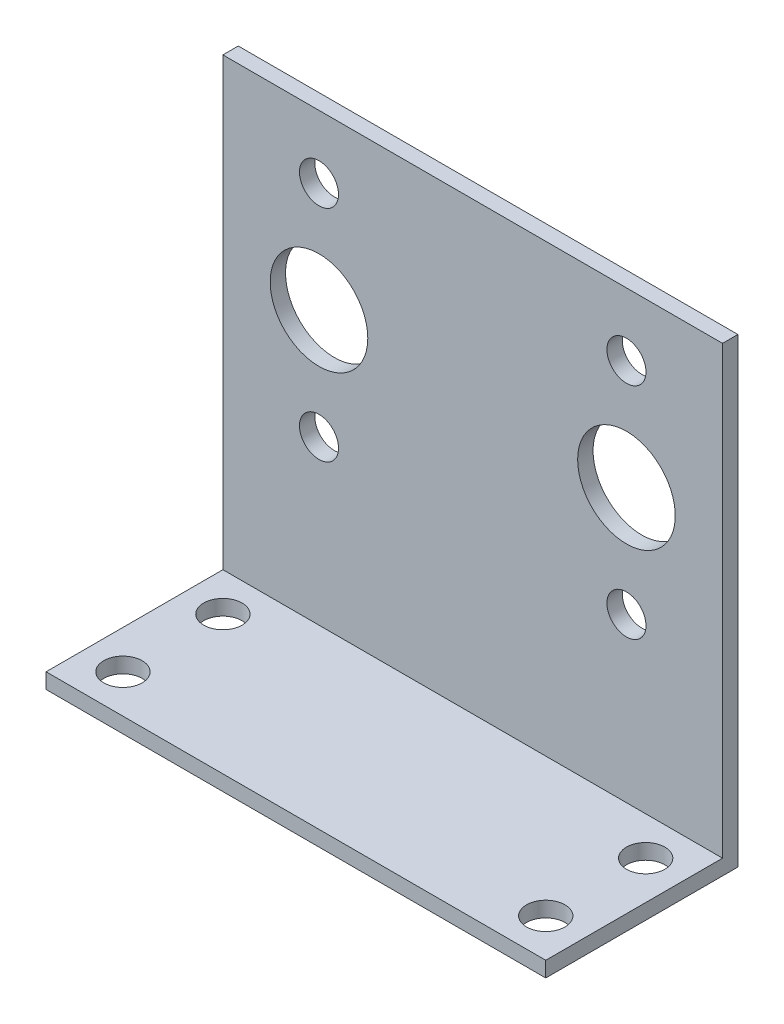
ISO-10303-21;
HEADER;
FILE_DESCRIPTION(('STEP AP214'),'2;1');
FILE_NAME('part.step','',(''),(''),'','','');
FILE_SCHEMA(('AUTOMOTIVE_DESIGN { 1 0 10303 214 1 1 1 1 }'));
ENDSEC;
DATA;
#1=APPLICATION_CONTEXT('core data for automotive mechanical design processes');
#2=APPLICATION_PROTOCOL_DEFINITION('international standard','automotive_design',2000,#1);
#3=PRODUCT_CONTEXT('',#1,'mechanical');
#4=PRODUCT('Part','Part','',(#3));
#5=PRODUCT_RELATED_PRODUCT_CATEGORY('part','',(#4));
#6=PRODUCT_DEFINITION_FORMATION('','',#4);
#7=PRODUCT_DEFINITION_CONTEXT('part definition',#1,'design');
#8=PRODUCT_DEFINITION('design','',#6,#7);
#9=PRODUCT_DEFINITION_SHAPE('','',#8);
#10=(LENGTH_UNIT() NAMED_UNIT(*) SI_UNIT(.MILLI.,.METRE.));
#11=(NAMED_UNIT(*) PLANE_ANGLE_UNIT() SI_UNIT($,.RADIAN.));
#12=(NAMED_UNIT(*) SI_UNIT($,.STERADIAN.) SOLID_ANGLE_UNIT());
#13=UNCERTAINTY_MEASURE_WITH_UNIT(LENGTH_MEASURE(1.E-05),#10,'distance_accuracy_value','');
#14=(GEOMETRIC_REPRESENTATION_CONTEXT(3) GLOBAL_UNCERTAINTY_ASSIGNED_CONTEXT((#13)) GLOBAL_UNIT_ASSIGNED_CONTEXT((#10,
#11,#12)) REPRESENTATION_CONTEXT('',''));
#15=CARTESIAN_POINT('',(0.,0.,0.));
#16=DIRECTION('',(0.,0.,1.));
#17=DIRECTION('',(1.,0.,0.));
#18=AXIS2_PLACEMENT_3D('',#15,#16,#17);
#19=CARTESIAN_POINT('',(0.,0.,4.));
#20=DIRECTION('',(0.,0.,-1.));
#21=DIRECTION('',(-1.,0.,0.));
#22=AXIS2_PLACEMENT_3D('',#19,#20,#21);
#23=PLANE('',#22);
#24=CARTESIAN_POINT('',(-40.,15.,4.));
#25=DIRECTION('',(0.,0.,1.));
#26=DIRECTION('',(1.,0.,0.));
#27=AXIS2_PLACEMENT_3D('',#24,#25,#26);
#28=CIRCLE('',#27,12.7);
#29=CARTESIAN_POINT('',(-27.3,15.,4.));
#30=VERTEX_POINT('',#29);
#31=EDGE_CURVE('E135',#30,#30,#28,.T.);
#32=ORIENTED_EDGE('',*,*,#31,.F.);
#33=EDGE_LOOP('',(#32));
#34=FACE_BOUND('',#33,.T.);
#35=CARTESIAN_POINT('',(40.,43.575,4.));
#36=DIRECTION('',(0.,0.,1.));
#37=DIRECTION('',(-1.,0.,0.));
#38=AXIS2_PLACEMENT_3D('',#35,#36,#37);
#39=CIRCLE('',#38,5.08000000000001);
#40=CARTESIAN_POINT('',(34.92,43.575,4.));
#41=VERTEX_POINT('',#40);
#42=EDGE_CURVE('E125',#41,#41,#39,.T.);
#43=ORIENTED_EDGE('',*,*,#42,.F.);
#44=EDGE_LOOP('',(#43));
#45=FACE_BOUND('',#44,.T.);
#46=CARTESIAN_POINT('',(40.,15.,4.));
#47=DIRECTION('',(0.,0.,1.));
#48=DIRECTION('',(-1.,0.,0.));
#49=AXIS2_PLACEMENT_3D('',#46,#47,#48);
#50=CIRCLE('',#49,12.7);
#51=CARTESIAN_POINT('',(27.3,15.,4.));
#52=VERTEX_POINT('',#51);
#53=EDGE_CURVE('E129',#52,#52,#50,.T.);
#54=ORIENTED_EDGE('',*,*,#53,.F.);
#55=EDGE_LOOP('',(#54));
#56=FACE_BOUND('',#55,.T.);
#57=CARTESIAN_POINT('',(40.,-13.575,4.));
#58=DIRECTION('',(0.,0.,1.));
#59=DIRECTION('',(1.,0.,0.));
#60=AXIS2_PLACEMENT_3D('',#57,#58,#59);
#61=CIRCLE('',#60,5.08000000000001);
#62=CARTESIAN_POINT('',(45.08,-13.575,4.));
#63=VERTEX_POINT('',#62);
#64=EDGE_CURVE('E148',#63,#63,#61,.T.);
#65=ORIENTED_EDGE('',*,*,#64,.F.);
#66=EDGE_LOOP('',(#65));
#67=FACE_BOUND('',#66,.T.);
#68=CARTESIAN_POINT('',(-40.,-13.575,4.));
#69=DIRECTION('',(0.,0.,1.));
#70=DIRECTION('',(-1.,0.,0.));
#71=AXIS2_PLACEMENT_3D('',#68,#69,#70);
#72=CIRCLE('',#71,5.08000000000001);
#73=CARTESIAN_POINT('',(-45.08,-13.575,4.));
#74=VERTEX_POINT('',#73);
#75=EDGE_CURVE('E142',#74,#74,#72,.T.);
#76=ORIENTED_EDGE('',*,*,#75,.F.);
#77=EDGE_LOOP('',(#76));
#78=FACE_BOUND('',#77,.T.);
#79=CARTESIAN_POINT('',(-40.,43.575,4.));
#80=DIRECTION('',(0.,0.,1.));
#81=DIRECTION('',(1.,0.,0.));
#82=AXIS2_PLACEMENT_3D('',#79,#80,#81);
#83=CIRCLE('',#82,5.08000000000001);
#84=CARTESIAN_POINT('',(-34.92,43.575,4.));
#85=VERTEX_POINT('',#84);
#86=EDGE_CURVE('E136',#85,#85,#83,.T.);
#87=ORIENTED_EDGE('',*,*,#86,.F.);
#88=EDGE_LOOP('',(#87));
#89=FACE_BOUND('',#88,.T.);
#90=DIRECTION('',(-1.,0.,0.));
#91=VECTOR('',#90,1.);
#92=CARTESIAN_POINT('',(0.,-56.,4.));
#93=LINE('',#92,#91);
#94=CARTESIAN_POINT('',(65.,-56.,4.));
#95=VERTEX_POINT('',#94);
#96=CARTESIAN_POINT('',(-65.,-56.,4.));
#97=VERTEX_POINT('',#96);
#98=EDGE_CURVE('E51',#95,#97,#93,.T.);
#99=ORIENTED_EDGE('',*,*,#98,.F.);
#100=DIRECTION('',(0.,1.,0.));
#101=VECTOR('',#100,1.);
#102=CARTESIAN_POINT('',(65.,60.,4.));
#103=LINE('',#102,#101);
#104=CARTESIAN_POINT('',(65.,60.,4.));
#105=VERTEX_POINT('',#104);
#106=EDGE_CURVE('E163',#95,#105,#103,.T.);
#107=ORIENTED_EDGE('',*,*,#106,.T.);
#108=DIRECTION('',(-1.,0.,0.));
#109=VECTOR('',#108,1.);
#110=CARTESIAN_POINT('',(65.,60.,4.));
#111=LINE('',#110,#109);
#112=CARTESIAN_POINT('',(-65.,60.,4.));
#113=VERTEX_POINT('',#112);
#114=EDGE_CURVE('E166',#105,#113,#111,.T.);
#115=ORIENTED_EDGE('',*,*,#114,.T.);
#116=DIRECTION('',(0.,-1.,0.));
#117=VECTOR('',#116,1.);
#118=CARTESIAN_POINT('',(-65.,60.,4.));
#119=LINE('',#118,#117);
#120=EDGE_CURVE('E56',#113,#97,#119,.T.);
#121=ORIENTED_EDGE('',*,*,#120,.T.);
#122=EDGE_LOOP('',(#99,#107,#115,#121));
#123=FACE_BOUND('',#122,.T.);
#124=ADVANCED_FACE('F36',(#34,#45,#56,#67,#78,#89,#123),#23,.F.);
#125=CARTESIAN_POINT('',(-65.,60.,4.));
#126=DIRECTION('',(1.,0.,0.));
#127=DIRECTION('',(0.,0.,-1.));
#128=AXIS2_PLACEMENT_3D('',#125,#126,#127);
#129=PLANE('',#128);
#130=DIRECTION('',(0.,0.,-1.));
#131=VECTOR('',#130,1.);
#132=CARTESIAN_POINT('',(-65.,-60.,4.));
#133=LINE('',#132,#131);
#134=CARTESIAN_POINT('',(-65.,-60.,50.));
#135=VERTEX_POINT('',#134);
#136=CARTESIAN_POINT('',(-65.,-60.,0.));
#137=VERTEX_POINT('',#136);
#138=EDGE_CURVE('E11',#135,#137,#133,.T.);
#139=ORIENTED_EDGE('',*,*,#138,.F.);
#140=DIRECTION('',(0.,-1.,0.));
#141=VECTOR('',#140,1.);
#142=CARTESIAN_POINT('',(-65.,0.,50.));
#143=LINE('',#142,#141);
#144=CARTESIAN_POINT('',(-65.,-56.,50.));
#145=VERTEX_POINT('',#144);
#146=EDGE_CURVE('E102',#145,#135,#143,.T.);
#147=ORIENTED_EDGE('',*,*,#146,.F.);
#148=DIRECTION('',(0.,0.,-1.));
#149=VECTOR('',#148,1.);
#150=CARTESIAN_POINT('',(-65.,-56.,50.));
#151=LINE('',#150,#149);
#152=EDGE_CURVE('E120',#145,#97,#151,.T.);
#153=ORIENTED_EDGE('',*,*,#152,.T.);
#154=ORIENTED_EDGE('',*,*,#120,.F.);
#155=DIRECTION('',(0.,0.,-1.));
#156=VECTOR('',#155,1.);
#157=CARTESIAN_POINT('',(-65.,60.,4.));
#158=LINE('',#157,#156);
#159=CARTESIAN_POINT('',(-65.,60.,0.));
#160=VERTEX_POINT('',#159);
#161=EDGE_CURVE('E168',#113,#160,#158,.T.);
#162=ORIENTED_EDGE('',*,*,#161,.T.);
#163=DIRECTION('',(0.,-1.,0.));
#164=VECTOR('',#163,1.);
#165=CARTESIAN_POINT('',(-65.,60.,0.));
#166=LINE('',#165,#164);
#167=EDGE_CURVE('E159',#160,#137,#166,.T.);
#168=ORIENTED_EDGE('',*,*,#167,.T.);
#169=EDGE_LOOP('',(#139,#147,#153,#154,#162,#168));
#170=FACE_BOUND('',#169,.T.);
#171=ADVANCED_FACE('F38',(#170),#129,.F.);
#172=CARTESIAN_POINT('',(65.,-60.,4.));
#173=DIRECTION('',(0.,1.,0.));
#174=DIRECTION('',(-1.,0.,0.));
#175=AXIS2_PLACEMENT_3D('',#172,#173,#174);
#176=PLANE('',#175);
#177=CARTESIAN_POINT('',(55.,-60.,14.));
#178=DIRECTION('',(0.,-1.,0.));
#179=DIRECTION('',(0.,0.,1.));
#180=AXIS2_PLACEMENT_3D('',#177,#178,#179);
#181=CIRCLE('',#180,5.);
#182=CARTESIAN_POINT('',(55.,-60.,19.));
#183=VERTEX_POINT('',#182);
#184=EDGE_CURVE('E231',#183,#183,#181,.T.);
#185=ORIENTED_EDGE('',*,*,#184,.F.);
#186=EDGE_LOOP('',(#185));
#187=FACE_BOUND('',#186,.T.);
#188=CARTESIAN_POINT('',(55.,-60.,40.));
#189=DIRECTION('',(0.,-1.,0.));
#190=DIRECTION('',(0.,0.,1.));
#191=AXIS2_PLACEMENT_3D('',#188,#189,#190);
#192=CIRCLE('',#191,5.);
#193=CARTESIAN_POINT('',(55.,-60.,45.));
#194=VERTEX_POINT('',#193);
#195=EDGE_CURVE('E235',#194,#194,#192,.T.);
#196=ORIENTED_EDGE('',*,*,#195,.F.);
#197=EDGE_LOOP('',(#196));
#198=FACE_BOUND('',#197,.T.);
#199=CARTESIAN_POINT('',(-55.,-60.,14.));
#200=DIRECTION('',(0.,1.,0.));
#201=DIRECTION('',(0.,0.,1.));
#202=AXIS2_PLACEMENT_3D('',#199,#200,#201);
#203=CIRCLE('',#202,5.);
#204=CARTESIAN_POINT('',(-55.,-60.,19.));
#205=VERTEX_POINT('',#204);
#206=EDGE_CURVE('E108',#205,#205,#203,.T.);
#207=ORIENTED_EDGE('',*,*,#206,.T.);
#208=EDGE_LOOP('',(#207));
#209=FACE_BOUND('',#208,.T.);
#210=CARTESIAN_POINT('',(-55.,-60.,40.));
#211=DIRECTION('',(0.,1.,0.));
#212=DIRECTION('',(0.,0.,1.));
#213=AXIS2_PLACEMENT_3D('',#210,#211,#212);
#214=CIRCLE('',#213,5.);
#215=CARTESIAN_POINT('',(-55.,-60.,45.));
#216=VERTEX_POINT('',#215);
#217=EDGE_CURVE('E240',#216,#216,#214,.T.);
#218=ORIENTED_EDGE('',*,*,#217,.T.);
#219=EDGE_LOOP('',(#218));
#220=FACE_BOUND('',#219,.T.);
#221=DIRECTION('',(1.,0.,0.));
#222=VECTOR('',#221,1.);
#223=CARTESIAN_POINT('',(65.,-60.,0.));
#224=LINE('',#223,#222);
#225=CARTESIAN_POINT('',(65.,-60.,0.));
#226=VERTEX_POINT('',#225);
#227=EDGE_CURVE('E91',#137,#226,#224,.T.);
#228=ORIENTED_EDGE('',*,*,#227,.T.);
#229=DIRECTION('',(0.,0.,-1.));
#230=VECTOR('',#229,1.);
#231=CARTESIAN_POINT('',(65.,-60.,4.));
#232=LINE('',#231,#230);
#233=CARTESIAN_POINT('',(65.,-60.,50.));
#234=VERTEX_POINT('',#233);
#235=EDGE_CURVE('E44',#234,#226,#232,.T.);
#236=ORIENTED_EDGE('',*,*,#235,.F.);
#237=DIRECTION('',(-1.,0.,0.));
#238=VECTOR('',#237,1.);
#239=CARTESIAN_POINT('',(0.,-60.,50.));
#240=LINE('',#239,#238);
#241=EDGE_CURVE('E89',#234,#135,#240,.T.);
#242=ORIENTED_EDGE('',*,*,#241,.T.);
#243=ORIENTED_EDGE('',*,*,#138,.T.);
#244=EDGE_LOOP('',(#228,#236,#242,#243));
#245=FACE_BOUND('',#244,.T.);
#246=ADVANCED_FACE('F88',(#187,#198,#209,#220,#245),#176,.F.);
#247=CARTESIAN_POINT('',(65.,60.,4.));
#248=DIRECTION('',(-1.,0.,0.));
#249=DIRECTION('',(0.,-1.,0.));
#250=AXIS2_PLACEMENT_3D('',#247,#248,#249);
#251=PLANE('',#250);
#252=DIRECTION('',(0.,1.,0.));
#253=VECTOR('',#252,1.);
#254=CARTESIAN_POINT('',(65.,60.,0.));
#255=LINE('',#254,#253);
#256=CARTESIAN_POINT('',(65.,60.,0.));
#257=VERTEX_POINT('',#256);
#258=EDGE_CURVE('E171',#226,#257,#255,.T.);
#259=ORIENTED_EDGE('',*,*,#258,.T.);
#260=DIRECTION('',(0.,0.,-1.));
#261=VECTOR('',#260,1.);
#262=CARTESIAN_POINT('',(65.,60.,4.));
#263=LINE('',#262,#261);
#264=EDGE_CURVE('E95',#105,#257,#263,.T.);
#265=ORIENTED_EDGE('',*,*,#264,.F.);
#266=ORIENTED_EDGE('',*,*,#106,.F.);
#267=DIRECTION('',(0.,0.,-1.));
#268=VECTOR('',#267,1.);
#269=CARTESIAN_POINT('',(65.,-56.,50.));
#270=LINE('',#269,#268);
#271=CARTESIAN_POINT('',(65.,-56.,50.));
#272=VERTEX_POINT('',#271);
#273=EDGE_CURVE('E106',#272,#95,#270,.T.);
#274=ORIENTED_EDGE('',*,*,#273,.F.);
#275=DIRECTION('',(0.,-1.,0.));
#276=VECTOR('',#275,1.);
#277=CARTESIAN_POINT('',(64.9999999999998,2.25514051876984E-13,50.));
#278=LINE('',#277,#276);
#279=EDGE_CURVE('E100',#272,#234,#278,.T.);
#280=ORIENTED_EDGE('',*,*,#279,.T.);
#281=ORIENTED_EDGE('',*,*,#235,.T.);
#282=EDGE_LOOP('',(#259,#265,#266,#274,#280,#281));
#283=FACE_BOUND('',#282,.T.);
#284=ADVANCED_FACE('F104',(#283),#251,.F.);
#285=CARTESIAN_POINT('',(65.,60.,4.));
#286=DIRECTION('',(0.,-1.,0.));
#287=DIRECTION('',(1.,0.,0.));
#288=AXIS2_PLACEMENT_3D('',#285,#286,#287);
#289=PLANE('',#288);
#290=DIRECTION('',(-1.,0.,0.));
#291=VECTOR('',#290,1.);
#292=CARTESIAN_POINT('',(65.,60.,0.));
#293=LINE('',#292,#291);
#294=EDGE_CURVE('E164',#257,#160,#293,.T.);
#295=ORIENTED_EDGE('',*,*,#294,.T.);
#296=ORIENTED_EDGE('',*,*,#161,.F.);
#297=ORIENTED_EDGE('',*,*,#114,.F.);
#298=ORIENTED_EDGE('',*,*,#264,.T.);
#299=EDGE_LOOP('',(#295,#296,#297,#298));
#300=FACE_BOUND('',#299,.T.);
#301=ADVANCED_FACE('F181',(#300),#289,.F.);
#302=CARTESIAN_POINT('',(0.,0.,0.));
#303=DIRECTION('',(0.,0.,-1.));
#304=DIRECTION('',(-1.,0.,0.));
#305=AXIS2_PLACEMENT_3D('',#302,#303,#304);
#306=PLANE('',#305);
#307=ORIENTED_EDGE('',*,*,#227,.F.);
#308=ORIENTED_EDGE('',*,*,#167,.F.);
#309=ORIENTED_EDGE('',*,*,#294,.F.);
#310=ORIENTED_EDGE('',*,*,#258,.F.);
#311=EDGE_LOOP('',(#307,#308,#309,#310));
#312=FACE_BOUND('',#311,.T.);
#313=CARTESIAN_POINT('',(-40.,43.575,0.));
#314=DIRECTION('',(0.,0.,1.));
#315=DIRECTION('',(1.,0.,0.));
#316=AXIS2_PLACEMENT_3D('',#313,#314,#315);
#317=CIRCLE('',#316,5.08000000000001);
#318=CARTESIAN_POINT('',(-34.92,43.575,0.));
#319=VERTEX_POINT('',#318);
#320=EDGE_CURVE('E132',#319,#319,#317,.T.);
#321=ORIENTED_EDGE('',*,*,#320,.T.);
#322=EDGE_LOOP('',(#321));
#323=FACE_BOUND('',#322,.T.);
#324=CARTESIAN_POINT('',(-40.,-13.575,0.));
#325=DIRECTION('',(0.,0.,1.));
#326=DIRECTION('',(-1.,0.,0.));
#327=AXIS2_PLACEMENT_3D('',#324,#325,#326);
#328=CIRCLE('',#327,5.08000000000001);
#329=CARTESIAN_POINT('',(-45.08,-13.575,0.));
#330=VERTEX_POINT('',#329);
#331=EDGE_CURVE('E139',#330,#330,#328,.T.);
#332=ORIENTED_EDGE('',*,*,#331,.T.);
#333=EDGE_LOOP('',(#332));
#334=FACE_BOUND('',#333,.T.);
#335=CARTESIAN_POINT('',(40.,-13.575,0.));
#336=DIRECTION('',(0.,0.,1.));
#337=DIRECTION('',(1.,0.,0.));
#338=AXIS2_PLACEMENT_3D('',#335,#336,#337);
#339=CIRCLE('',#338,5.08000000000001);
#340=CARTESIAN_POINT('',(45.08,-13.575,0.));
#341=VERTEX_POINT('',#340);
#342=EDGE_CURVE('E145',#341,#341,#339,.T.);
#343=ORIENTED_EDGE('',*,*,#342,.T.);
#344=EDGE_LOOP('',(#343));
#345=FACE_BOUND('',#344,.T.);
#346=CARTESIAN_POINT('',(40.,15.,0.));
#347=DIRECTION('',(0.,0.,1.));
#348=DIRECTION('',(-1.,0.,0.));
#349=AXIS2_PLACEMENT_3D('',#346,#347,#348);
#350=CIRCLE('',#349,12.7);
#351=CARTESIAN_POINT('',(27.3,15.,0.));
#352=VERTEX_POINT('',#351);
#353=EDGE_CURVE('E151',#352,#352,#350,.T.);
#354=ORIENTED_EDGE('',*,*,#353,.T.);
#355=EDGE_LOOP('',(#354));
#356=FACE_BOUND('',#355,.T.);
#357=CARTESIAN_POINT('',(40.,43.575,0.));
#358=DIRECTION('',(0.,0.,1.));
#359=DIRECTION('',(-1.,0.,0.));
#360=AXIS2_PLACEMENT_3D('',#357,#358,#359);
#361=CIRCLE('',#360,5.08000000000001);
#362=CARTESIAN_POINT('',(34.92,43.575,0.));
#363=VERTEX_POINT('',#362);
#364=EDGE_CURVE('E126',#363,#363,#361,.T.);
#365=ORIENTED_EDGE('',*,*,#364,.T.);
#366=EDGE_LOOP('',(#365));
#367=FACE_BOUND('',#366,.T.);
#368=CARTESIAN_POINT('',(-40.,15.,0.));
#369=DIRECTION('',(0.,0.,1.));
#370=DIRECTION('',(1.,0.,0.));
#371=AXIS2_PLACEMENT_3D('',#368,#369,#370);
#372=CIRCLE('',#371,12.7);
#373=CARTESIAN_POINT('',(-27.3,15.,0.));
#374=VERTEX_POINT('',#373);
#375=EDGE_CURVE('E156',#374,#374,#372,.T.);
#376=ORIENTED_EDGE('',*,*,#375,.T.);
#377=EDGE_LOOP('',(#376));
#378=FACE_BOUND('',#377,.T.);
#379=ADVANCED_FACE('F185',(#312,#323,#334,#345,#356,#367,#378),#306,.T.);
#380=CARTESIAN_POINT('',(-40.,15.,0.));
#381=DIRECTION('',(0.,0.,1.));
#382=DIRECTION('',(1.,0.,0.));
#383=AXIS2_PLACEMENT_3D('',#380,#381,#382);
#384=CYLINDRICAL_SURFACE('',#383,12.7);
#385=ORIENTED_EDGE('',*,*,#375,.F.);
#386=EDGE_LOOP('',(#385));
#387=FACE_BOUND('',#386,.T.);
#388=ORIENTED_EDGE('',*,*,#31,.T.);
#389=EDGE_LOOP('',(#388));
#390=FACE_BOUND('',#389,.T.);
#391=ADVANCED_FACE('F217',(#387,#390),#384,.F.);
#392=CARTESIAN_POINT('',(40.,43.575,0.));
#393=DIRECTION('',(0.,0.,1.));
#394=DIRECTION('',(1.,0.,0.));
#395=AXIS2_PLACEMENT_3D('',#392,#393,#394);
#396=CYLINDRICAL_SURFACE('',#395,5.08000000000001);
#397=ORIENTED_EDGE('',*,*,#364,.F.);
#398=EDGE_LOOP('',(#397));
#399=FACE_BOUND('',#398,.T.);
#400=ORIENTED_EDGE('',*,*,#42,.T.);
#401=EDGE_LOOP('',(#400));
#402=FACE_BOUND('',#401,.T.);
#403=ADVANCED_FACE('F342',(#399,#402),#396,.F.);
#404=CARTESIAN_POINT('',(40.,15.,0.));
#405=DIRECTION('',(0.,0.,1.));
#406=DIRECTION('',(1.,0.,0.));
#407=AXIS2_PLACEMENT_3D('',#404,#405,#406);
#408=CYLINDRICAL_SURFACE('',#407,12.7);
#409=ORIENTED_EDGE('',*,*,#353,.F.);
#410=EDGE_LOOP('',(#409));
#411=FACE_BOUND('',#410,.T.);
#412=ORIENTED_EDGE('',*,*,#53,.T.);
#413=EDGE_LOOP('',(#412));
#414=FACE_BOUND('',#413,.T.);
#415=ADVANCED_FACE('F348',(#411,#414),#408,.F.);
#416=CARTESIAN_POINT('',(40.,-13.575,0.));
#417=DIRECTION('',(0.,0.,1.));
#418=DIRECTION('',(1.,0.,0.));
#419=AXIS2_PLACEMENT_3D('',#416,#417,#418);
#420=CYLINDRICAL_SURFACE('',#419,5.08000000000001);
#421=ORIENTED_EDGE('',*,*,#342,.F.);
#422=EDGE_LOOP('',(#421));
#423=FACE_BOUND('',#422,.T.);
#424=ORIENTED_EDGE('',*,*,#64,.T.);
#425=EDGE_LOOP('',(#424));
#426=FACE_BOUND('',#425,.T.);
#427=ADVANCED_FACE('F355',(#423,#426),#420,.F.);
#428=CARTESIAN_POINT('',(-40.,-13.575,0.));
#429=DIRECTION('',(0.,0.,1.));
#430=DIRECTION('',(1.,0.,0.));
#431=AXIS2_PLACEMENT_3D('',#428,#429,#430);
#432=CYLINDRICAL_SURFACE('',#431,5.08000000000001);
#433=ORIENTED_EDGE('',*,*,#331,.F.);
#434=EDGE_LOOP('',(#433));
#435=FACE_BOUND('',#434,.T.);
#436=ORIENTED_EDGE('',*,*,#75,.T.);
#437=EDGE_LOOP('',(#436));
#438=FACE_BOUND('',#437,.T.);
#439=ADVANCED_FACE('F201',(#435,#438),#432,.F.);
#440=CARTESIAN_POINT('',(-40.,43.575,0.));
#441=DIRECTION('',(0.,0.,1.));
#442=DIRECTION('',(1.,0.,0.));
#443=AXIS2_PLACEMENT_3D('',#440,#441,#442);
#444=CYLINDRICAL_SURFACE('',#443,5.08000000000001);
#445=ORIENTED_EDGE('',*,*,#320,.F.);
#446=EDGE_LOOP('',(#445));
#447=FACE_BOUND('',#446,.T.);
#448=ORIENTED_EDGE('',*,*,#86,.T.);
#449=EDGE_LOOP('',(#448));
#450=FACE_BOUND('',#449,.T.);
#451=ADVANCED_FACE('F192',(#447,#450),#444,.F.);
#452=CARTESIAN_POINT('',(0.,-56.,50.));
#453=DIRECTION('',(0.,-1.,0.));
#454=DIRECTION('',(0.,0.,-1.));
#455=AXIS2_PLACEMENT_3D('',#452,#453,#454);
#456=PLANE('',#455);
#457=CARTESIAN_POINT('',(55.,-56.,14.));
#458=DIRECTION('',(0.,-1.,0.));
#459=DIRECTION('',(0.,0.,1.));
#460=AXIS2_PLACEMENT_3D('',#457,#458,#459);
#461=CIRCLE('',#460,5.);
#462=CARTESIAN_POINT('',(55.,-56.,19.));
#463=VERTEX_POINT('',#462);
#464=EDGE_CURVE('E250',#463,#463,#461,.T.);
#465=ORIENTED_EDGE('',*,*,#464,.T.);
#466=EDGE_LOOP('',(#465));
#467=FACE_BOUND('',#466,.T.);
#468=CARTESIAN_POINT('',(55.,-56.,40.));
#469=DIRECTION('',(0.,-1.,0.));
#470=DIRECTION('',(0.,0.,1.));
#471=AXIS2_PLACEMENT_3D('',#468,#469,#470);
#472=CIRCLE('',#471,5.);
#473=CARTESIAN_POINT('',(55.,-56.,45.));
#474=VERTEX_POINT('',#473);
#475=EDGE_CURVE('E246',#474,#474,#472,.T.);
#476=ORIENTED_EDGE('',*,*,#475,.T.);
#477=EDGE_LOOP('',(#476));
#478=FACE_BOUND('',#477,.T.);
#479=CARTESIAN_POINT('',(-55.,-56.,14.));
#480=DIRECTION('',(0.,1.,0.));
#481=DIRECTION('',(0.,0.,1.));
#482=AXIS2_PLACEMENT_3D('',#479,#480,#481);
#483=CIRCLE('',#482,5.);
#484=CARTESIAN_POINT('',(-55.,-56.,19.));
#485=VERTEX_POINT('',#484);
#486=EDGE_CURVE('E111',#485,#485,#483,.T.);
#487=ORIENTED_EDGE('',*,*,#486,.F.);
#488=EDGE_LOOP('',(#487));
#489=FACE_BOUND('',#488,.T.);
#490=CARTESIAN_POINT('',(-55.,-56.,40.));
#491=DIRECTION('',(0.,1.,0.));
#492=DIRECTION('',(0.,0.,1.));
#493=AXIS2_PLACEMENT_3D('',#490,#491,#492);
#494=CIRCLE('',#493,5.);
#495=CARTESIAN_POINT('',(-55.,-56.,45.));
#496=VERTEX_POINT('',#495);
#497=EDGE_CURVE('E114',#496,#496,#494,.T.);
#498=ORIENTED_EDGE('',*,*,#497,.F.);
#499=EDGE_LOOP('',(#498));
#500=FACE_BOUND('',#499,.T.);
#501=ORIENTED_EDGE('',*,*,#273,.T.);
#502=ORIENTED_EDGE('',*,*,#98,.T.);
#503=ORIENTED_EDGE('',*,*,#152,.F.);
#504=DIRECTION('',(-1.,0.,0.));
#505=VECTOR('',#504,1.);
#506=CARTESIAN_POINT('',(0.,-56.,50.));
#507=LINE('',#506,#505);
#508=EDGE_CURVE('E118',#272,#145,#507,.T.);
#509=ORIENTED_EDGE('',*,*,#508,.F.);
#510=EDGE_LOOP('',(#501,#502,#503,#509));
#511=FACE_BOUND('',#510,.T.);
#512=ADVANCED_FACE('F190',(#467,#478,#489,#500,#511),#456,.F.);
#513=CARTESIAN_POINT('',(0.,0.,50.));
#514=DIRECTION('',(0.,0.,-1.));
#515=DIRECTION('',(-1.,0.,0.));
#516=AXIS2_PLACEMENT_3D('',#513,#514,#515);
#517=PLANE('',#516);
#518=ORIENTED_EDGE('',*,*,#279,.F.);
#519=ORIENTED_EDGE('',*,*,#508,.T.);
#520=ORIENTED_EDGE('',*,*,#146,.T.);
#521=ORIENTED_EDGE('',*,*,#241,.F.);
#522=EDGE_LOOP('',(#518,#519,#520,#521));
#523=FACE_BOUND('',#522,.T.);
#524=ADVANCED_FACE('F99',(#523),#517,.F.);
#525=CARTESIAN_POINT('',(-55.,-60.,40.));
#526=DIRECTION('',(0.,1.,0.));
#527=DIRECTION('',(0.,0.,1.));
#528=AXIS2_PLACEMENT_3D('',#525,#526,#527);
#529=CYLINDRICAL_SURFACE('',#528,5.);
#530=ORIENTED_EDGE('',*,*,#217,.F.);
#531=EDGE_LOOP('',(#530));
#532=FACE_BOUND('',#531,.T.);
#533=ORIENTED_EDGE('',*,*,#497,.T.);
#534=EDGE_LOOP('',(#533));
#535=FACE_BOUND('',#534,.T.);
#536=ADVANCED_FACE('F199',(#532,#535),#529,.F.);
#537=CARTESIAN_POINT('',(-55.,-60.,14.));
#538=DIRECTION('',(0.,1.,0.));
#539=DIRECTION('',(0.,0.,1.));
#540=AXIS2_PLACEMENT_3D('',#537,#538,#539);
#541=CYLINDRICAL_SURFACE('',#540,5.);
#542=ORIENTED_EDGE('',*,*,#206,.F.);
#543=EDGE_LOOP('',(#542));
#544=FACE_BOUND('',#543,.T.);
#545=ORIENTED_EDGE('',*,*,#486,.T.);
#546=EDGE_LOOP('',(#545));
#547=FACE_BOUND('',#546,.T.);
#548=ADVANCED_FACE('F262',(#544,#547),#541,.F.);
#549=CARTESIAN_POINT('',(55.,-60.,40.));
#550=DIRECTION('',(0.,1.,0.));
#551=DIRECTION('',(0.,0.,1.));
#552=AXIS2_PLACEMENT_3D('',#549,#550,#551);
#553=CYLINDRICAL_SURFACE('',#552,5.);
#554=ORIENTED_EDGE('',*,*,#195,.T.);
#555=EDGE_LOOP('',(#554));
#556=FACE_BOUND('',#555,.T.);
#557=ORIENTED_EDGE('',*,*,#475,.F.);
#558=EDGE_LOOP('',(#557));
#559=FACE_BOUND('',#558,.T.);
#560=ADVANCED_FACE('F256',(#556,#559),#553,.F.);
#561=CARTESIAN_POINT('',(55.,-60.,14.));
#562=DIRECTION('',(0.,1.,0.));
#563=DIRECTION('',(0.,0.,1.));
#564=AXIS2_PLACEMENT_3D('',#561,#562,#563);
#565=CYLINDRICAL_SURFACE('',#564,5.);
#566=ORIENTED_EDGE('',*,*,#184,.T.);
#567=EDGE_LOOP('',(#566));
#568=FACE_BOUND('',#567,.T.);
#569=ORIENTED_EDGE('',*,*,#464,.F.);
#570=EDGE_LOOP('',(#569));
#571=FACE_BOUND('',#570,.T.);
#572=ADVANCED_FACE('F253',(#568,#571),#565,.F.);
#573=CLOSED_SHELL('',(#124,#171,#246,#284,#301,#379,#391,#403,#415,#427,#439,#451,#512,#524,
#536,#548,#560,#572));
#574=MANIFOLD_SOLID_BREP('B2',#573);
#575=ADVANCED_BREP_SHAPE_REPRESENTATION('',(#18,#574),#14);
#576=SHAPE_DEFINITION_REPRESENTATION(#9,#575);
ENDSEC;
END-ISO-10303-21;
